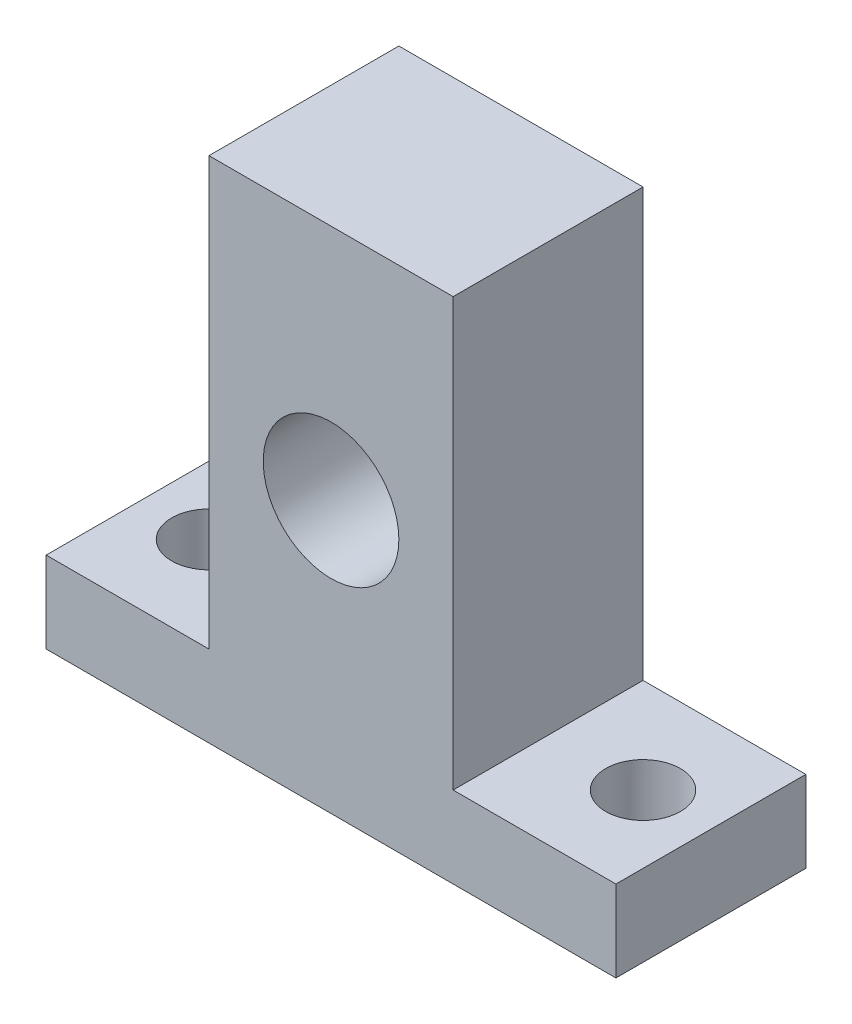
ISO-10303-21;
HEADER;
FILE_DESCRIPTION(('STEP AP214'),'2;1');
FILE_NAME('part.step','',(''),(''),'','','');
FILE_SCHEMA(('AUTOMOTIVE_DESIGN { 1 0 10303 214 1 1 1 1 }'));
ENDSEC;
DATA;
#1=APPLICATION_CONTEXT('core data for automotive mechanical design processes');
#2=APPLICATION_PROTOCOL_DEFINITION('international standard','automotive_design',2000,#1);
#3=PRODUCT_CONTEXT('',#1,'mechanical');
#4=PRODUCT('Part','Part','',(#3));
#5=PRODUCT_RELATED_PRODUCT_CATEGORY('part','',(#4));
#6=PRODUCT_DEFINITION_FORMATION('','',#4);
#7=PRODUCT_DEFINITION_CONTEXT('part definition',#1,'design');
#8=PRODUCT_DEFINITION('design','',#6,#7);
#9=PRODUCT_DEFINITION_SHAPE('','',#8);
#10=(LENGTH_UNIT() NAMED_UNIT(*) SI_UNIT(.MILLI.,.METRE.));
#11=(NAMED_UNIT(*) PLANE_ANGLE_UNIT() SI_UNIT($,.RADIAN.));
#12=(NAMED_UNIT(*) SI_UNIT($,.STERADIAN.) SOLID_ANGLE_UNIT());
#13=UNCERTAINTY_MEASURE_WITH_UNIT(LENGTH_MEASURE(1.E-05),#10,'distance_accuracy_value','');
#14=(GEOMETRIC_REPRESENTATION_CONTEXT(3) GLOBAL_UNCERTAINTY_ASSIGNED_CONTEXT((#13)) GLOBAL_UNIT_ASSIGNED_CONTEXT((#10,
#11,#12)) REPRESENTATION_CONTEXT('',''));
#15=CARTESIAN_POINT('',(0.,0.,0.));
#16=DIRECTION('',(0.,0.,1.));
#17=DIRECTION('',(1.,0.,0.));
#18=AXIS2_PLACEMENT_3D('',#15,#16,#17);
#19=CARTESIAN_POINT('',(0.,0.,14.));
#20=DIRECTION('',(0.,0.,-1.));
#21=DIRECTION('',(-1.,0.,0.));
#22=AXIS2_PLACEMENT_3D('',#19,#20,#21);
#23=PLANE('',#22);
#24=DIRECTION('',(0.,1.,0.));
#25=VECTOR('',#24,1.);
#26=CARTESIAN_POINT('',(9.,6.00000000000001,14.));
#27=LINE('',#26,#25);
#28=CARTESIAN_POINT('',(9.,6.00000000000001,14.));
#29=VERTEX_POINT('',#28);
#30=CARTESIAN_POINT('',(9.00000000000001,37.5,14.));
#31=VERTEX_POINT('',#30);
#32=EDGE_CURVE('E146',#29,#31,#27,.T.);
#33=ORIENTED_EDGE('',*,*,#32,.T.);
#34=DIRECTION('',(-1.,0.,0.));
#35=VECTOR('',#34,1.);
#36=CARTESIAN_POINT('',(-9.,37.5,14.));
#37=LINE('',#36,#35);
#38=CARTESIAN_POINT('',(-9.,37.5,14.));
#39=VERTEX_POINT('',#38);
#40=EDGE_CURVE('E94',#31,#39,#37,.T.);
#41=ORIENTED_EDGE('',*,*,#40,.T.);
#42=DIRECTION('',(0.,-1.,0.));
#43=VECTOR('',#42,1.);
#44=CARTESIAN_POINT('',(-8.99999999999999,6.,14.));
#45=LINE('',#44,#43);
#46=CARTESIAN_POINT('',(-8.99999999999999,6.,14.));
#47=VERTEX_POINT('',#46);
#48=EDGE_CURVE('E162',#39,#47,#45,.T.);
#49=ORIENTED_EDGE('',*,*,#48,.T.);
#50=DIRECTION('',(-1.,0.,0.));
#51=VECTOR('',#50,1.);
#52=CARTESIAN_POINT('',(-8.99999999999999,6.,14.));
#53=LINE('',#52,#51);
#54=CARTESIAN_POINT('',(-21.,6.,14.));
#55=VERTEX_POINT('',#54);
#56=EDGE_CURVE('E175',#47,#55,#53,.T.);
#57=ORIENTED_EDGE('',*,*,#56,.T.);
#58=DIRECTION('',(0.,-1.,0.));
#59=VECTOR('',#58,1.);
#60=CARTESIAN_POINT('',(-21.,0.,14.));
#61=LINE('',#60,#59);
#62=CARTESIAN_POINT('',(-21.,0.,14.));
#63=VERTEX_POINT('',#62);
#64=EDGE_CURVE('E113',#55,#63,#61,.T.);
#65=ORIENTED_EDGE('',*,*,#64,.T.);
#66=DIRECTION('',(1.,0.,0.));
#67=VECTOR('',#66,1.);
#68=CARTESIAN_POINT('',(-21.,0.,14.));
#69=LINE('',#68,#67);
#70=CARTESIAN_POINT('',(21.,0.,14.));
#71=VERTEX_POINT('',#70);
#72=EDGE_CURVE('E107',#63,#71,#69,.T.);
#73=ORIENTED_EDGE('',*,*,#72,.T.);
#74=DIRECTION('',(0.,1.,0.));
#75=VECTOR('',#74,1.);
#76=CARTESIAN_POINT('',(21.,0.,14.));
#77=LINE('',#76,#75);
#78=CARTESIAN_POINT('',(21.,6.00000000000001,14.));
#79=VERTEX_POINT('',#78);
#80=EDGE_CURVE('E111',#71,#79,#77,.T.);
#81=ORIENTED_EDGE('',*,*,#80,.T.);
#82=DIRECTION('',(-1.,0.,0.));
#83=VECTOR('',#82,1.);
#84=CARTESIAN_POINT('',(9.,6.00000000000001,14.));
#85=LINE('',#84,#83);
#86=EDGE_CURVE('E51',#79,#29,#85,.T.);
#87=ORIENTED_EDGE('',*,*,#86,.T.);
#88=EDGE_LOOP('',(#33,#41,#49,#57,#65,#73,#81,#87));
#89=FACE_BOUND('',#88,.T.);
#90=CARTESIAN_POINT('',(0.,20.,14.));
#91=DIRECTION('',(0.,0.,1.));
#92=DIRECTION('',(1.,0.,0.));
#93=AXIS2_PLACEMENT_3D('',#90,#91,#92);
#94=CIRCLE('',#93,5.);
#95=CARTESIAN_POINT('',(5.,20.,14.));
#96=VERTEX_POINT('',#95);
#97=EDGE_CURVE('E135',#96,#96,#94,.T.);
#98=ORIENTED_EDGE('',*,*,#97,.F.);
#99=EDGE_LOOP('',(#98));
#100=FACE_BOUND('',#99,.T.);
#101=ADVANCED_FACE('F33',(#89,#100),#23,.F.);
#102=CARTESIAN_POINT('',(0.,0.,0.));
#103=DIRECTION('',(0.,0.,-1.));
#104=DIRECTION('',(-1.,0.,0.));
#105=AXIS2_PLACEMENT_3D('',#102,#103,#104);
#106=PLANE('',#105);
#107=DIRECTION('',(0.,1.,0.));
#108=VECTOR('',#107,1.);
#109=CARTESIAN_POINT('',(9.,6.00000000000001,0.));
#110=LINE('',#109,#108);
#111=CARTESIAN_POINT('',(9.,6.00000000000001,0.));
#112=VERTEX_POINT('',#111);
#113=CARTESIAN_POINT('',(9.00000000000001,37.5,0.));
#114=VERTEX_POINT('',#113);
#115=EDGE_CURVE('E131',#112,#114,#110,.T.);
#116=ORIENTED_EDGE('',*,*,#115,.F.);
#117=DIRECTION('',(-1.,0.,0.));
#118=VECTOR('',#117,1.);
#119=CARTESIAN_POINT('',(9.,6.00000000000001,0.));
#120=LINE('',#119,#118);
#121=CARTESIAN_POINT('',(21.,6.00000000000001,0.));
#122=VERTEX_POINT('',#121);
#123=EDGE_CURVE('E86',#122,#112,#120,.T.);
#124=ORIENTED_EDGE('',*,*,#123,.F.);
#125=DIRECTION('',(0.,1.,0.));
#126=VECTOR('',#125,1.);
#127=CARTESIAN_POINT('',(21.,0.,0.));
#128=LINE('',#127,#126);
#129=CARTESIAN_POINT('',(21.,0.,0.));
#130=VERTEX_POINT('',#129);
#131=EDGE_CURVE('E80',#130,#122,#128,.T.);
#132=ORIENTED_EDGE('',*,*,#131,.F.);
#133=DIRECTION('',(1.,0.,0.));
#134=VECTOR('',#133,1.);
#135=CARTESIAN_POINT('',(-21.,0.,0.));
#136=LINE('',#135,#134);
#137=CARTESIAN_POINT('',(-21.,0.,0.));
#138=VERTEX_POINT('',#137);
#139=EDGE_CURVE('E121',#138,#130,#136,.T.);
#140=ORIENTED_EDGE('',*,*,#139,.F.);
#141=DIRECTION('',(0.,-1.,0.));
#142=VECTOR('',#141,1.);
#143=CARTESIAN_POINT('',(-21.,0.,0.));
#144=LINE('',#143,#142);
#145=CARTESIAN_POINT('',(-21.,6.,0.));
#146=VERTEX_POINT('',#145);
#147=EDGE_CURVE('E141',#146,#138,#144,.T.);
#148=ORIENTED_EDGE('',*,*,#147,.F.);
#149=DIRECTION('',(-1.,0.,0.));
#150=VECTOR('',#149,1.);
#151=CARTESIAN_POINT('',(-8.99999999999999,6.,0.));
#152=LINE('',#151,#150);
#153=CARTESIAN_POINT('',(-8.99999999999999,6.,0.));
#154=VERTEX_POINT('',#153);
#155=EDGE_CURVE('E139',#154,#146,#152,.T.);
#156=ORIENTED_EDGE('',*,*,#155,.F.);
#157=DIRECTION('',(0.,-1.,0.));
#158=VECTOR('',#157,1.);
#159=CARTESIAN_POINT('',(-8.99999999999999,6.,0.));
#160=LINE('',#159,#158);
#161=CARTESIAN_POINT('',(-9.,37.5,0.));
#162=VERTEX_POINT('',#161);
#163=EDGE_CURVE('E137',#162,#154,#160,.T.);
#164=ORIENTED_EDGE('',*,*,#163,.F.);
#165=DIRECTION('',(-1.,0.,0.));
#166=VECTOR('',#165,1.);
#167=CARTESIAN_POINT('',(-9.,37.5,0.));
#168=LINE('',#167,#166);
#169=EDGE_CURVE('E134',#114,#162,#168,.T.);
#170=ORIENTED_EDGE('',*,*,#169,.F.);
#171=EDGE_LOOP('',(#116,#124,#132,#140,#148,#156,#164,#170));
#172=FACE_BOUND('',#171,.T.);
#173=CARTESIAN_POINT('',(0.,20.,0.));
#174=DIRECTION('',(0.,0.,1.));
#175=DIRECTION('',(1.,0.,0.));
#176=AXIS2_PLACEMENT_3D('',#173,#174,#175);
#177=CIRCLE('',#176,5.);
#178=CARTESIAN_POINT('',(5.,20.,0.));
#179=VERTEX_POINT('',#178);
#180=EDGE_CURVE('E181',#179,#179,#177,.T.);
#181=ORIENTED_EDGE('',*,*,#180,.T.);
#182=EDGE_LOOP('',(#181));
#183=FACE_BOUND('',#182,.T.);
#184=ADVANCED_FACE('F166',(#172,#183),#106,.T.);
#185=CARTESIAN_POINT('',(9.,6.00000000000001,14.));
#186=DIRECTION('',(-1.,0.,0.));
#187=DIRECTION('',(0.,-1.,0.));
#188=AXIS2_PLACEMENT_3D('',#185,#186,#187);
#189=PLANE('',#188);
#190=ORIENTED_EDGE('',*,*,#115,.T.);
#191=DIRECTION('',(0.,0.,-1.));
#192=VECTOR('',#191,1.);
#193=CARTESIAN_POINT('',(9.00000000000001,37.5,14.));
#194=LINE('',#193,#192);
#195=EDGE_CURVE('E11',#31,#114,#194,.T.);
#196=ORIENTED_EDGE('',*,*,#195,.F.);
#197=ORIENTED_EDGE('',*,*,#32,.F.);
#198=DIRECTION('',(0.,0.,-1.));
#199=VECTOR('',#198,1.);
#200=CARTESIAN_POINT('',(9.,6.00000000000001,14.));
#201=LINE('',#200,#199);
#202=EDGE_CURVE('E127',#29,#112,#201,.T.);
#203=ORIENTED_EDGE('',*,*,#202,.T.);
#204=EDGE_LOOP('',(#190,#196,#197,#203));
#205=FACE_BOUND('',#204,.T.);
#206=ADVANCED_FACE('F35',(#205),#189,.F.);
#207=CARTESIAN_POINT('',(-9.,37.5,14.));
#208=DIRECTION('',(0.,-1.,0.));
#209=DIRECTION('',(0.,0.,-1.));
#210=AXIS2_PLACEMENT_3D('',#207,#208,#209);
#211=PLANE('',#210);
#212=ORIENTED_EDGE('',*,*,#169,.T.);
#213=DIRECTION('',(0.,0.,-1.));
#214=VECTOR('',#213,1.);
#215=CARTESIAN_POINT('',(-9.,37.5,14.));
#216=LINE('',#215,#214);
#217=EDGE_CURVE('E43',#39,#162,#216,.T.);
#218=ORIENTED_EDGE('',*,*,#217,.F.);
#219=ORIENTED_EDGE('',*,*,#40,.F.);
#220=ORIENTED_EDGE('',*,*,#195,.T.);
#221=EDGE_LOOP('',(#212,#218,#219,#220));
#222=FACE_BOUND('',#221,.T.);
#223=ADVANCED_FACE('F232',(#222),#211,.F.);
#224=CARTESIAN_POINT('',(-8.99999999999999,6.,14.));
#225=DIRECTION('',(1.,0.,0.));
#226=DIRECTION('',(0.,1.,0.));
#227=AXIS2_PLACEMENT_3D('',#224,#225,#226);
#228=PLANE('',#227);
#229=ORIENTED_EDGE('',*,*,#163,.T.);
#230=DIRECTION('',(0.,0.,-1.));
#231=VECTOR('',#230,1.);
#232=CARTESIAN_POINT('',(-8.99999999999999,6.,14.));
#233=LINE('',#232,#231);
#234=EDGE_CURVE('E153',#47,#154,#233,.T.);
#235=ORIENTED_EDGE('',*,*,#234,.F.);
#236=ORIENTED_EDGE('',*,*,#48,.F.);
#237=ORIENTED_EDGE('',*,*,#217,.T.);
#238=EDGE_LOOP('',(#229,#235,#236,#237));
#239=FACE_BOUND('',#238,.T.);
#240=ADVANCED_FACE('F160',(#239),#228,.F.);
#241=CARTESIAN_POINT('',(-8.99999999999999,6.,14.));
#242=DIRECTION('',(0.,-1.,0.));
#243=DIRECTION('',(1.,0.,0.));
#244=AXIS2_PLACEMENT_3D('',#241,#242,#243);
#245=PLANE('',#244);
#246=CARTESIAN_POINT('',(-16.,6.00000000000001,7.));
#247=DIRECTION('',(0.,-1.,0.));
#248=DIRECTION('',(1.,0.,0.));
#249=AXIS2_PLACEMENT_3D('',#246,#247,#248);
#250=CIRCLE('',#249,2.75);
#251=CARTESIAN_POINT('',(-13.25,6.00000000000001,7.));
#252=VERTEX_POINT('',#251);
#253=EDGE_CURVE('E184',#252,#252,#250,.T.);
#254=ORIENTED_EDGE('',*,*,#253,.T.);
#255=EDGE_LOOP('',(#254));
#256=FACE_BOUND('',#255,.T.);
#257=ORIENTED_EDGE('',*,*,#155,.T.);
#258=DIRECTION('',(0.,0.,-1.));
#259=VECTOR('',#258,1.);
#260=CARTESIAN_POINT('',(-21.,6.,14.));
#261=LINE('',#260,#259);
#262=EDGE_CURVE('E150',#55,#146,#261,.T.);
#263=ORIENTED_EDGE('',*,*,#262,.F.);
#264=ORIENTED_EDGE('',*,*,#56,.F.);
#265=ORIENTED_EDGE('',*,*,#234,.T.);
#266=EDGE_LOOP('',(#257,#263,#264,#265));
#267=FACE_BOUND('',#266,.T.);
#268=ADVANCED_FACE('F171',(#256,#267),#245,.F.);
#269=CARTESIAN_POINT('',(-21.,0.,14.));
#270=DIRECTION('',(1.,0.,0.));
#271=DIRECTION('',(0.,1.,0.));
#272=AXIS2_PLACEMENT_3D('',#269,#270,#271);
#273=PLANE('',#272);
#274=ORIENTED_EDGE('',*,*,#147,.T.);
#275=DIRECTION('',(0.,0.,-1.));
#276=VECTOR('',#275,1.);
#277=CARTESIAN_POINT('',(-21.,0.,14.));
#278=LINE('',#277,#276);
#279=EDGE_CURVE('E122',#63,#138,#278,.T.);
#280=ORIENTED_EDGE('',*,*,#279,.F.);
#281=ORIENTED_EDGE('',*,*,#64,.F.);
#282=ORIENTED_EDGE('',*,*,#262,.T.);
#283=EDGE_LOOP('',(#274,#280,#281,#282));
#284=FACE_BOUND('',#283,.T.);
#285=ADVANCED_FACE('F174',(#284),#273,.F.);
#286=CARTESIAN_POINT('',(-21.,0.,14.));
#287=DIRECTION('',(0.,1.,0.));
#288=DIRECTION('',(-1.,0.,0.));
#289=AXIS2_PLACEMENT_3D('',#286,#287,#288);
#290=PLANE('',#289);
#291=CARTESIAN_POINT('',(16.,0.,7.));
#292=DIRECTION('',(0.,-1.,0.));
#293=DIRECTION('',(-1.,0.,0.));
#294=AXIS2_PLACEMENT_3D('',#291,#292,#293);
#295=CIRCLE('',#294,2.75);
#296=CARTESIAN_POINT('',(13.25,0.,7.));
#297=VERTEX_POINT('',#296);
#298=EDGE_CURVE('E192',#297,#297,#295,.T.);
#299=ORIENTED_EDGE('',*,*,#298,.F.);
#300=EDGE_LOOP('',(#299));
#301=FACE_BOUND('',#300,.T.);
#302=CARTESIAN_POINT('',(-16.,0.,7.));
#303=DIRECTION('',(0.,-1.,0.));
#304=DIRECTION('',(1.,0.,0.));
#305=AXIS2_PLACEMENT_3D('',#302,#303,#304);
#306=CIRCLE('',#305,2.75);
#307=CARTESIAN_POINT('',(-13.25,0.,7.));
#308=VERTEX_POINT('',#307);
#309=EDGE_CURVE('E189',#308,#308,#306,.T.);
#310=ORIENTED_EDGE('',*,*,#309,.F.);
#311=EDGE_LOOP('',(#310));
#312=FACE_BOUND('',#311,.T.);
#313=ORIENTED_EDGE('',*,*,#139,.T.);
#314=DIRECTION('',(0.,0.,-1.));
#315=VECTOR('',#314,1.);
#316=CARTESIAN_POINT('',(21.,0.,14.));
#317=LINE('',#316,#315);
#318=EDGE_CURVE('E118',#71,#130,#317,.T.);
#319=ORIENTED_EDGE('',*,*,#318,.F.);
#320=ORIENTED_EDGE('',*,*,#72,.F.);
#321=ORIENTED_EDGE('',*,*,#279,.T.);
#322=EDGE_LOOP('',(#313,#319,#320,#321));
#323=FACE_BOUND('',#322,.T.);
#324=ADVANCED_FACE('F119',(#301,#312,#323),#290,.F.);
#325=CARTESIAN_POINT('',(21.,0.,14.));
#326=DIRECTION('',(-1.,0.,0.));
#327=DIRECTION('',(0.,-1.,0.));
#328=AXIS2_PLACEMENT_3D('',#325,#326,#327);
#329=PLANE('',#328);
#330=ORIENTED_EDGE('',*,*,#131,.T.);
#331=DIRECTION('',(0.,0.,-1.));
#332=VECTOR('',#331,1.);
#333=CARTESIAN_POINT('',(21.,6.00000000000001,14.));
#334=LINE('',#333,#332);
#335=EDGE_CURVE('E123',#79,#122,#334,.T.);
#336=ORIENTED_EDGE('',*,*,#335,.F.);
#337=ORIENTED_EDGE('',*,*,#80,.F.);
#338=ORIENTED_EDGE('',*,*,#318,.T.);
#339=EDGE_LOOP('',(#330,#336,#337,#338));
#340=FACE_BOUND('',#339,.T.);
#341=ADVANCED_FACE('F125',(#340),#329,.F.);
#342=CARTESIAN_POINT('',(9.,6.00000000000001,14.));
#343=DIRECTION('',(0.,-1.,0.));
#344=DIRECTION('',(1.,0.,0.));
#345=AXIS2_PLACEMENT_3D('',#342,#343,#344);
#346=PLANE('',#345);
#347=CARTESIAN_POINT('',(16.,6.00000000000001,7.));
#348=DIRECTION('',(0.,-1.,0.));
#349=DIRECTION('',(1.,0.,0.));
#350=AXIS2_PLACEMENT_3D('',#347,#348,#349);
#351=CIRCLE('',#350,2.75);
#352=CARTESIAN_POINT('',(18.75,6.00000000000001,7.));
#353=VERTEX_POINT('',#352);
#354=EDGE_CURVE('E37',#353,#353,#351,.T.);
#355=ORIENTED_EDGE('',*,*,#354,.T.);
#356=EDGE_LOOP('',(#355));
#357=FACE_BOUND('',#356,.T.);
#358=ORIENTED_EDGE('',*,*,#123,.T.);
#359=ORIENTED_EDGE('',*,*,#202,.F.);
#360=ORIENTED_EDGE('',*,*,#86,.F.);
#361=ORIENTED_EDGE('',*,*,#335,.T.);
#362=EDGE_LOOP('',(#358,#359,#360,#361));
#363=FACE_BOUND('',#362,.T.);
#364=ADVANCED_FACE('F199',(#357,#363),#346,.F.);
#365=CARTESIAN_POINT('',(0.,20.,14.));
#366=DIRECTION('',(0.,0.,-1.));
#367=DIRECTION('',(-1.,0.,0.));
#368=AXIS2_PLACEMENT_3D('',#365,#366,#367);
#369=CYLINDRICAL_SURFACE('',#368,5.);
#370=ORIENTED_EDGE('',*,*,#97,.T.);
#371=EDGE_LOOP('',(#370));
#372=FACE_BOUND('',#371,.T.);
#373=ORIENTED_EDGE('',*,*,#180,.F.);
#374=EDGE_LOOP('',(#373));
#375=FACE_BOUND('',#374,.T.);
#376=ADVANCED_FACE('F208',(#372,#375),#369,.F.);
#377=CARTESIAN_POINT('',(-16.,37.5,7.));
#378=DIRECTION('',(0.,-1.,0.));
#379=DIRECTION('',(1.,0.,0.));
#380=AXIS2_PLACEMENT_3D('',#377,#378,#379);
#381=CYLINDRICAL_SURFACE('',#380,2.75);
#382=ORIENTED_EDGE('',*,*,#309,.T.);
#383=EDGE_LOOP('',(#382));
#384=FACE_BOUND('',#383,.T.);
#385=ORIENTED_EDGE('',*,*,#253,.F.);
#386=EDGE_LOOP('',(#385));
#387=FACE_BOUND('',#386,.T.);
#388=ADVANCED_FACE('F203',(#384,#387),#381,.F.);
#389=CARTESIAN_POINT('',(16.,37.5,7.));
#390=DIRECTION('',(0.,-1.,0.));
#391=DIRECTION('',(1.,0.,0.));
#392=AXIS2_PLACEMENT_3D('',#389,#390,#391);
#393=CYLINDRICAL_SURFACE('',#392,2.75);
#394=ORIENTED_EDGE('',*,*,#298,.T.);
#395=EDGE_LOOP('',(#394));
#396=FACE_BOUND('',#395,.T.);
#397=ORIENTED_EDGE('',*,*,#354,.F.);
#398=EDGE_LOOP('',(#397));
#399=FACE_BOUND('',#398,.T.);
#400=ADVANCED_FACE('F201',(#396,#399),#393,.F.);
#401=CLOSED_SHELL('',(#101,#184,#206,#223,#240,#268,#285,#324,#341,#364,#376,#388,#400));
#402=MANIFOLD_SOLID_BREP('B2',#401);
#403=ADVANCED_BREP_SHAPE_REPRESENTATION('',(#18,#402),#14);
#404=SHAPE_DEFINITION_REPRESENTATION(#9,#403);
ENDSEC;
END-ISO-10303-21;
